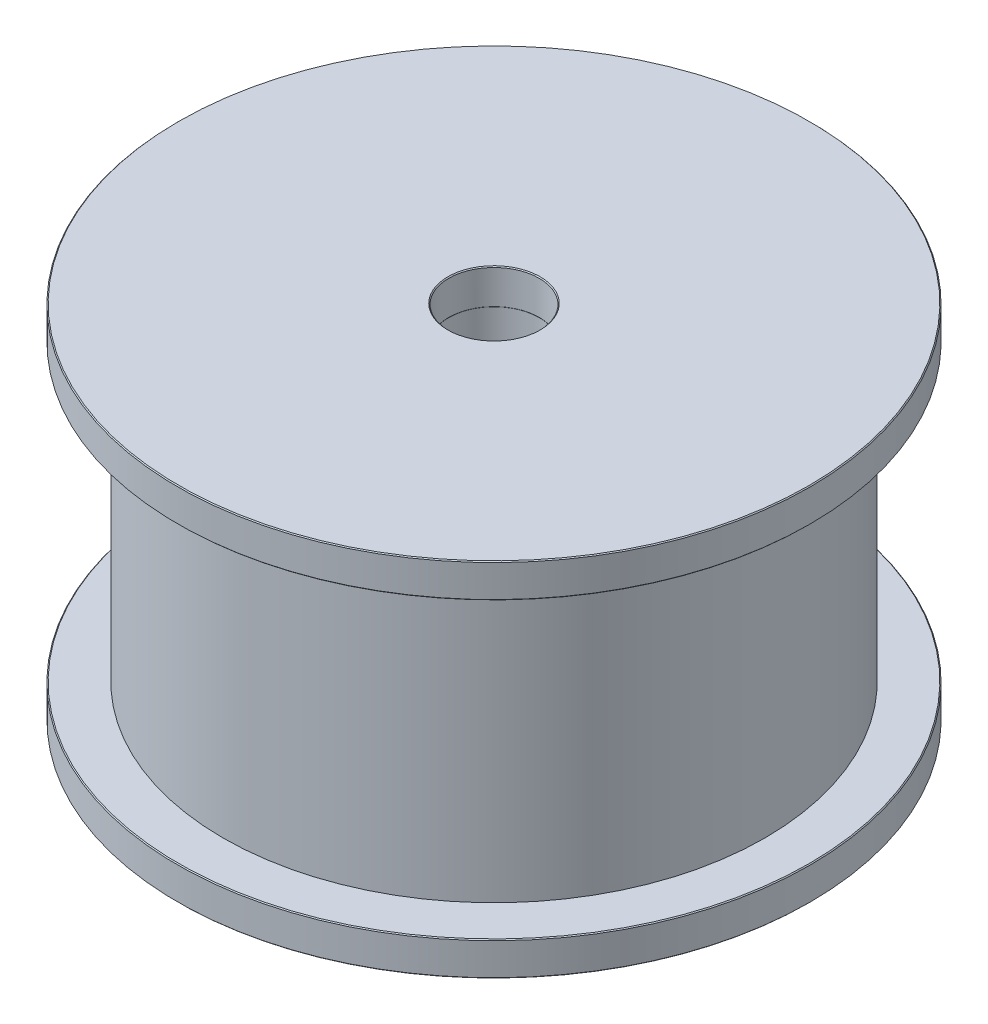
ISO-10303-21;
HEADER;
FILE_DESCRIPTION(('STEP AP214'),'2;1');
FILE_NAME('part.step','',(''),(''),'','','');
FILE_SCHEMA(('AUTOMOTIVE_DESIGN { 1 0 10303 214 1 1 1 1 }'));
ENDSEC;
DATA;
#1=APPLICATION_CONTEXT('core data for automotive mechanical design processes');
#2=APPLICATION_PROTOCOL_DEFINITION('international standard','automotive_design',2000,#1);
#3=PRODUCT_CONTEXT('',#1,'mechanical');
#4=PRODUCT('Part','Part','',(#3));
#5=PRODUCT_RELATED_PRODUCT_CATEGORY('part','',(#4));
#6=PRODUCT_DEFINITION_FORMATION('','',#4);
#7=PRODUCT_DEFINITION_CONTEXT('part definition',#1,'design');
#8=PRODUCT_DEFINITION('design','',#6,#7);
#9=PRODUCT_DEFINITION_SHAPE('','',#8);
#10=(LENGTH_UNIT() NAMED_UNIT(*) SI_UNIT(.MILLI.,.METRE.));
#11=(NAMED_UNIT(*) PLANE_ANGLE_UNIT() SI_UNIT($,.RADIAN.));
#12=(NAMED_UNIT(*) SI_UNIT($,.STERADIAN.) SOLID_ANGLE_UNIT());
#13=UNCERTAINTY_MEASURE_WITH_UNIT(LENGTH_MEASURE(1.E-05),#10,'distance_accuracy_value','');
#14=(GEOMETRIC_REPRESENTATION_CONTEXT(3) GLOBAL_UNCERTAINTY_ASSIGNED_CONTEXT((#13)) GLOBAL_UNIT_ASSIGNED_CONTEXT((#10,
#11,#12)) REPRESENTATION_CONTEXT('',''));
#15=CARTESIAN_POINT('',(0.,0.,0.));
#16=DIRECTION('',(0.,0.,1.));
#17=DIRECTION('',(1.,0.,0.));
#18=AXIS2_PLACEMENT_3D('',#15,#16,#17);
#19=CARTESIAN_POINT('',(0.,50.8,0.));
#20=DIRECTION('',(0.,1.,0.));
#21=DIRECTION('',(-1.,0.,0.));
#22=AXIS2_PLACEMENT_3D('',#19,#20,#21);
#23=CYLINDRICAL_SURFACE('',#22,44.45);
#24=CARTESIAN_POINT('',(0.,4.63550000000001,0.));
#25=DIRECTION('',(0.,-1.,0.));
#26=DIRECTION('',(1.,0.,0.));
#27=AXIS2_PLACEMENT_3D('',#24,#25,#26);
#28=CIRCLE('',#27,44.45);
#29=CARTESIAN_POINT('',(44.45,4.63550000000001,0.));
#30=VERTEX_POINT('',#29);
#31=EDGE_CURVE('E94',#30,#30,#28,.T.);
#32=ORIENTED_EDGE('',*,*,#31,.T.);
#33=EDGE_LOOP('',(#32));
#34=FACE_BOUND('',#33,.T.);
#35=CARTESIAN_POINT('',(0.,0.126999999999988,0.));
#36=DIRECTION('',(0.,1.,0.));
#37=DIRECTION('',(-1.,0.,0.));
#38=AXIS2_PLACEMENT_3D('',#35,#36,#37);
#39=CIRCLE('',#38,44.45);
#40=CARTESIAN_POINT('',(-44.45,0.12699999999999,0.));
#41=VERTEX_POINT('',#40);
#42=EDGE_CURVE('E98',#41,#41,#39,.T.);
#43=ORIENTED_EDGE('',*,*,#42,.T.);
#44=EDGE_LOOP('',(#43));
#45=FACE_BOUND('',#44,.T.);
#46=ADVANCED_FACE('F45',(#34,#45),#23,.T.);
#47=CARTESIAN_POINT('',(44.45,4.7625,0.));
#48=DIRECTION('',(0.,-1.,0.));
#49=DIRECTION('',(1.,0.,0.));
#50=AXIS2_PLACEMENT_3D('',#47,#48,#49);
#51=PLANE('',#50);
#52=CARTESIAN_POINT('',(0.,4.7625,0.));
#53=DIRECTION('',(0.,-1.,0.));
#54=DIRECTION('',(1.,0.,0.));
#55=AXIS2_PLACEMENT_3D('',#52,#53,#54);
#56=CIRCLE('',#55,44.323);
#57=CARTESIAN_POINT('',(44.323,4.7625,0.));
#58=VERTEX_POINT('',#57);
#59=EDGE_CURVE('E102',#58,#58,#56,.F.);
#60=ORIENTED_EDGE('',*,*,#59,.T.);
#61=EDGE_LOOP('',(#60));
#62=FACE_BOUND('',#61,.T.);
#63=CARTESIAN_POINT('',(0.,4.7625,0.));
#64=DIRECTION('',(0.,1.,0.));
#65=DIRECTION('',(-1.,0.,0.));
#66=AXIS2_PLACEMENT_3D('',#63,#64,#65);
#67=CIRCLE('',#66,38.1);
#68=CARTESIAN_POINT('',(-38.1,4.7625,0.));
#69=VERTEX_POINT('',#68);
#70=EDGE_CURVE('E118',#69,#69,#67,.T.);
#71=ORIENTED_EDGE('',*,*,#70,.F.);
#72=EDGE_LOOP('',(#71));
#73=FACE_BOUND('',#72,.T.);
#74=ADVANCED_FACE('F132',(#62,#73),#51,.F.);
#75=CARTESIAN_POINT('',(0.,50.8,0.));
#76=DIRECTION('',(0.,1.,0.));
#77=DIRECTION('',(-1.,0.,0.));
#78=AXIS2_PLACEMENT_3D('',#75,#76,#77);
#79=CYLINDRICAL_SURFACE('',#78,38.1);
#80=CARTESIAN_POINT('',(0.,46.0375,0.));
#81=DIRECTION('',(0.,1.,0.));
#82=DIRECTION('',(-1.,0.,0.));
#83=AXIS2_PLACEMENT_3D('',#80,#81,#82);
#84=CIRCLE('',#83,38.1);
#85=CARTESIAN_POINT('',(-38.1,46.0375,0.));
#86=VERTEX_POINT('',#85);
#87=EDGE_CURVE('E122',#86,#86,#84,.T.);
#88=ORIENTED_EDGE('',*,*,#87,.F.);
#89=EDGE_LOOP('',(#88));
#90=FACE_BOUND('',#89,.T.);
#91=ORIENTED_EDGE('',*,*,#70,.T.);
#92=EDGE_LOOP('',(#91));
#93=FACE_BOUND('',#92,.T.);
#94=ADVANCED_FACE('F129',(#90,#93),#79,.T.);
#95=CARTESIAN_POINT('',(38.1,46.0375,0.));
#96=DIRECTION('',(0.,1.,0.));
#97=DIRECTION('',(-1.,0.,0.));
#98=AXIS2_PLACEMENT_3D('',#95,#96,#97);
#99=PLANE('',#98);
#100=CARTESIAN_POINT('',(0.,46.0375,0.));
#101=DIRECTION('',(0.,1.,0.));
#102=DIRECTION('',(-1.,0.,0.));
#103=AXIS2_PLACEMENT_3D('',#100,#101,#102);
#104=CIRCLE('',#103,44.323);
#105=CARTESIAN_POINT('',(-44.323,46.0375,0.));
#106=VERTEX_POINT('',#105);
#107=EDGE_CURVE('E106',#106,#106,#104,.F.);
#108=ORIENTED_EDGE('',*,*,#107,.T.);
#109=EDGE_LOOP('',(#108));
#110=FACE_BOUND('',#109,.T.);
#111=ORIENTED_EDGE('',*,*,#87,.T.);
#112=EDGE_LOOP('',(#111));
#113=FACE_BOUND('',#112,.T.);
#114=ADVANCED_FACE('F127',(#110,#113),#99,.F.);
#115=CARTESIAN_POINT('',(0.,50.8,0.));
#116=DIRECTION('',(0.,1.,0.));
#117=DIRECTION('',(-1.,0.,0.));
#118=AXIS2_PLACEMENT_3D('',#115,#116,#117);
#119=CYLINDRICAL_SURFACE('',#118,44.45);
#120=CARTESIAN_POINT('',(0.,46.1645,0.));
#121=DIRECTION('',(0.,1.,0.));
#122=DIRECTION('',(-1.,0.,0.));
#123=AXIS2_PLACEMENT_3D('',#120,#121,#122);
#124=CIRCLE('',#123,44.45);
#125=CARTESIAN_POINT('',(-44.45,46.1645,0.));
#126=VERTEX_POINT('',#125);
#127=EDGE_CURVE('E110',#126,#126,#124,.T.);
#128=ORIENTED_EDGE('',*,*,#127,.T.);
#129=EDGE_LOOP('',(#128));
#130=FACE_BOUND('',#129,.T.);
#131=CARTESIAN_POINT('',(0.,50.673,0.));
#132=DIRECTION('',(0.,-1.,0.));
#133=DIRECTION('',(1.,0.,0.));
#134=AXIS2_PLACEMENT_3D('',#131,#132,#133);
#135=CIRCLE('',#134,44.45);
#136=CARTESIAN_POINT('',(44.45,50.673,0.));
#137=VERTEX_POINT('',#136);
#138=EDGE_CURVE('E114',#137,#137,#135,.T.);
#139=ORIENTED_EDGE('',*,*,#138,.T.);
#140=EDGE_LOOP('',(#139));
#141=FACE_BOUND('',#140,.T.);
#142=ADVANCED_FACE('F207',(#130,#141),#119,.T.);
#143=CARTESIAN_POINT('',(44.45,50.8,0.));
#144=DIRECTION('',(0.,-1.,0.));
#145=DIRECTION('',(1.,0.,0.));
#146=AXIS2_PLACEMENT_3D('',#143,#144,#145);
#147=PLANE('',#146);
#148=CARTESIAN_POINT('',(0.,50.8,0.));
#149=DIRECTION('',(0.,-1.,0.));
#150=DIRECTION('',(1.,0.,0.));
#151=AXIS2_PLACEMENT_3D('',#148,#149,#150);
#152=CIRCLE('',#151,44.323);
#153=CARTESIAN_POINT('',(44.323,50.8,0.));
#154=VERTEX_POINT('',#153);
#155=EDGE_CURVE('E64',#154,#154,#152,.F.);
#156=ORIENTED_EDGE('',*,*,#155,.T.);
#157=EDGE_LOOP('',(#156));
#158=FACE_BOUND('',#157,.T.);
#159=CARTESIAN_POINT('',(0.,50.8,0.));
#160=DIRECTION('',(0.,-1.,0.));
#161=DIRECTION('',(1.,0.,0.));
#162=AXIS2_PLACEMENT_3D('',#159,#160,#161);
#163=CIRCLE('',#162,6.48970000000004);
#164=CARTESIAN_POINT('',(6.48970000000005,50.8,0.));
#165=VERTEX_POINT('',#164);
#166=EDGE_CURVE('E70',#165,#165,#163,.T.);
#167=ORIENTED_EDGE('',*,*,#166,.T.);
#168=EDGE_LOOP('',(#167));
#169=FACE_BOUND('',#168,.T.);
#170=ADVANCED_FACE('F203',(#158,#169),#147,.F.);
#171=CARTESIAN_POINT('',(0.,50.8,0.));
#172=DIRECTION('',(0.,1.,0.));
#173=DIRECTION('',(-1.,0.,0.));
#174=AXIS2_PLACEMENT_3D('',#171,#172,#173);
#175=CYLINDRICAL_SURFACE('',#174,6.36270000000001);
#176=CARTESIAN_POINT('',(0.,45.9105,0.));
#177=DIRECTION('',(0.,1.,0.));
#178=DIRECTION('',(-1.,0.,0.));
#179=AXIS2_PLACEMENT_3D('',#176,#177,#178);
#180=CIRCLE('',#179,6.36270000000001);
#181=CARTESIAN_POINT('',(-6.3627,45.9105,0.));
#182=VERTEX_POINT('',#181);
#183=EDGE_CURVE('E54',#182,#182,#180,.F.);
#184=ORIENTED_EDGE('',*,*,#183,.T.);
#185=EDGE_LOOP('',(#184));
#186=FACE_BOUND('',#185,.T.);
#187=CARTESIAN_POINT('',(0.,50.673,0.));
#188=DIRECTION('',(0.,-1.,0.));
#189=DIRECTION('',(1.,0.,0.));
#190=AXIS2_PLACEMENT_3D('',#187,#188,#189);
#191=CIRCLE('',#190,6.36270000000001);
#192=CARTESIAN_POINT('',(6.36270000000001,50.673,0.));
#193=VERTEX_POINT('',#192);
#194=EDGE_CURVE('E59',#193,#193,#191,.F.);
#195=ORIENTED_EDGE('',*,*,#194,.T.);
#196=EDGE_LOOP('',(#195));
#197=FACE_BOUND('',#196,.T.);
#198=ADVANCED_FACE('F206',(#186,#197),#175,.F.);
#199=CARTESIAN_POINT('',(0.,50.8,0.));
#200=DIRECTION('',(0.,1.,0.));
#201=DIRECTION('',(-1.,0.,0.));
#202=AXIS2_PLACEMENT_3D('',#199,#200,#201);
#203=CYLINDRICAL_SURFACE('',#202,6.35);
#204=CARTESIAN_POINT('',(0.,45.8978,0.));
#205=DIRECTION('',(0.,-1.,0.));
#206=DIRECTION('',(1.,0.,0.));
#207=AXIS2_PLACEMENT_3D('',#204,#205,#206);
#208=CIRCLE('',#207,6.35);
#209=CARTESIAN_POINT('',(6.35000000000001,45.8978,0.));
#210=VERTEX_POINT('',#209);
#211=EDGE_CURVE('E74',#210,#210,#208,.F.);
#212=ORIENTED_EDGE('',*,*,#211,.T.);
#213=EDGE_LOOP('',(#212));
#214=FACE_BOUND('',#213,.T.);
#215=CARTESIAN_POINT('',(0.,4.9022,0.));
#216=DIRECTION('',(0.,1.,0.));
#217=DIRECTION('',(-1.,0.,0.));
#218=AXIS2_PLACEMENT_3D('',#215,#216,#217);
#219=CIRCLE('',#218,6.35);
#220=CARTESIAN_POINT('',(-6.35,4.9022,0.));
#221=VERTEX_POINT('',#220);
#222=EDGE_CURVE('E78',#221,#221,#219,.F.);
#223=ORIENTED_EDGE('',*,*,#222,.T.);
#224=EDGE_LOOP('',(#223));
#225=FACE_BOUND('',#224,.T.);
#226=ADVANCED_FACE('F214',(#214,#225),#203,.F.);
#227=CARTESIAN_POINT('',(0.,50.8,0.));
#228=DIRECTION('',(0.,1.,0.));
#229=DIRECTION('',(-1.,0.,0.));
#230=AXIS2_PLACEMENT_3D('',#227,#228,#229);
#231=CYLINDRICAL_SURFACE('',#230,6.3627);
#232=CARTESIAN_POINT('',(0.,4.8895,0.));
#233=DIRECTION('',(0.,-1.,0.));
#234=DIRECTION('',(1.,0.,0.));
#235=AXIS2_PLACEMENT_3D('',#232,#233,#234);
#236=CIRCLE('',#235,6.3627);
#237=CARTESIAN_POINT('',(6.3627,4.8895,0.));
#238=VERTEX_POINT('',#237);
#239=EDGE_CURVE('E10',#238,#238,#236,.F.);
#240=ORIENTED_EDGE('',*,*,#239,.T.);
#241=EDGE_LOOP('',(#240));
#242=FACE_BOUND('',#241,.T.);
#243=CARTESIAN_POINT('',(0.,0.127000000000002,0.));
#244=DIRECTION('',(0.,1.,0.));
#245=DIRECTION('',(-1.,0.,0.));
#246=AXIS2_PLACEMENT_3D('',#243,#244,#245);
#247=CIRCLE('',#246,6.3627);
#248=CARTESIAN_POINT('',(-6.3627,0.127000000000002,0.));
#249=VERTEX_POINT('',#248);
#250=EDGE_CURVE('E82',#249,#249,#247,.F.);
#251=ORIENTED_EDGE('',*,*,#250,.T.);
#252=EDGE_LOOP('',(#251));
#253=FACE_BOUND('',#252,.T.);
#254=ADVANCED_FACE('F219',(#242,#253),#231,.F.);
#255=CARTESIAN_POINT('',(6.3627,0.,0.));
#256=DIRECTION('',(0.,1.,0.));
#257=DIRECTION('',(-1.,0.,0.));
#258=AXIS2_PLACEMENT_3D('',#255,#256,#257);
#259=PLANE('',#258);
#260=CARTESIAN_POINT('',(0.,0.,0.));
#261=DIRECTION('',(0.,1.,0.));
#262=DIRECTION('',(-1.,0.,0.));
#263=AXIS2_PLACEMENT_3D('',#260,#261,#262);
#264=CIRCLE('',#263,6.4897);
#265=CARTESIAN_POINT('',(-6.4897,0.,0.));
#266=VERTEX_POINT('',#265);
#267=EDGE_CURVE('E86',#266,#266,#264,.T.);
#268=ORIENTED_EDGE('',*,*,#267,.T.);
#269=EDGE_LOOP('',(#268));
#270=FACE_BOUND('',#269,.T.);
#271=CARTESIAN_POINT('',(0.,0.,0.));
#272=DIRECTION('',(0.,1.,0.));
#273=DIRECTION('',(-1.,0.,0.));
#274=AXIS2_PLACEMENT_3D('',#271,#272,#273);
#275=CIRCLE('',#274,44.323);
#276=CARTESIAN_POINT('',(-44.323,0.,0.));
#277=VERTEX_POINT('',#276);
#278=EDGE_CURVE('E90',#277,#277,#275,.F.);
#279=ORIENTED_EDGE('',*,*,#278,.T.);
#280=EDGE_LOOP('',(#279));
#281=FACE_BOUND('',#280,.T.);
#282=ADVANCED_FACE('F155',(#270,#281),#259,.F.);
#283=CARTESIAN_POINT('',(0.,46.1645,0.));
#284=DIRECTION('',(0.,1.,0.));
#285=DIRECTION('',(-1.,0.,0.));
#286=AXIS2_PLACEMENT_3D('',#283,#284,#285);
#287=CONICAL_SURFACE('',#286,44.45,0.785398163397448);
#288=ORIENTED_EDGE('',*,*,#107,.F.);
#289=EDGE_LOOP('',(#288));
#290=FACE_BOUND('',#289,.T.);
#291=ORIENTED_EDGE('',*,*,#127,.F.);
#292=EDGE_LOOP('',(#291));
#293=FACE_BOUND('',#292,.T.);
#294=ADVANCED_FACE('F148',(#290,#293),#287,.T.);
#295=CARTESIAN_POINT('',(0.,4.7625,0.));
#296=DIRECTION('',(0.,-1.,0.));
#297=DIRECTION('',(1.,0.,0.));
#298=AXIS2_PLACEMENT_3D('',#295,#296,#297);
#299=CONICAL_SURFACE('',#298,44.323,0.785398163397394);
#300=ORIENTED_EDGE('',*,*,#31,.F.);
#301=EDGE_LOOP('',(#300));
#302=FACE_BOUND('',#301,.T.);
#303=ORIENTED_EDGE('',*,*,#59,.F.);
#304=EDGE_LOOP('',(#303));
#305=FACE_BOUND('',#304,.T.);
#306=ADVANCED_FACE('F154',(#302,#305),#299,.T.);
#307=CARTESIAN_POINT('',(0.,0.,0.));
#308=DIRECTION('',(0.,-1.,0.));
#309=DIRECTION('',(1.,0.,0.));
#310=AXIS2_PLACEMENT_3D('',#307,#308,#309);
#311=CONICAL_SURFACE('',#310,6.4897,0.785398163397438);
#312=ORIENTED_EDGE('',*,*,#250,.F.);
#313=EDGE_LOOP('',(#312));
#314=FACE_BOUND('',#313,.T.);
#315=ORIENTED_EDGE('',*,*,#267,.F.);
#316=EDGE_LOOP('',(#315));
#317=FACE_BOUND('',#316,.T.);
#318=ADVANCED_FACE('F162',(#314,#317),#311,.F.);
#319=CARTESIAN_POINT('',(0.,0.126999999999988,0.));
#320=DIRECTION('',(0.,1.,0.));
#321=DIRECTION('',(-1.,0.,0.));
#322=AXIS2_PLACEMENT_3D('',#319,#320,#321);
#323=CONICAL_SURFACE('',#322,44.45,0.785398163397448);
#324=ORIENTED_EDGE('',*,*,#278,.F.);
#325=EDGE_LOOP('',(#324));
#326=FACE_BOUND('',#325,.T.);
#327=ORIENTED_EDGE('',*,*,#42,.F.);
#328=EDGE_LOOP('',(#327));
#329=FACE_BOUND('',#328,.T.);
#330=ADVANCED_FACE('F169',(#326,#329),#323,.T.);
#331=CARTESIAN_POINT('',(0.,45.8978,0.));
#332=DIRECTION('',(0.,1.,0.));
#333=DIRECTION('',(-1.,0.,0.));
#334=AXIS2_PLACEMENT_3D('',#331,#332,#333);
#335=CONICAL_SURFACE('',#334,6.35,0.785398163397445);
#336=ORIENTED_EDGE('',*,*,#183,.F.);
#337=EDGE_LOOP('',(#336));
#338=FACE_BOUND('',#337,.T.);
#339=ORIENTED_EDGE('',*,*,#211,.F.);
#340=EDGE_LOOP('',(#339));
#341=FACE_BOUND('',#340,.T.);
#342=ADVANCED_FACE('F176',(#338,#341),#335,.F.);
#343=CARTESIAN_POINT('',(0.,4.7752,0.));
#344=DIRECTION('',(0.,-1.,0.));
#345=DIRECTION('',(1.,0.,0.));
#346=AXIS2_PLACEMENT_3D('',#343,#344,#345);
#347=CONICAL_SURFACE('',#346,6.47700000000001,0.785398163397448);
#348=ORIENTED_EDGE('',*,*,#222,.F.);
#349=EDGE_LOOP('',(#348));
#350=FACE_BOUND('',#349,.T.);
#351=ORIENTED_EDGE('',*,*,#239,.F.);
#352=EDGE_LOOP('',(#351));
#353=FACE_BOUND('',#352,.T.);
#354=ADVANCED_FACE('F183',(#350,#353),#347,.F.);
#355=CARTESIAN_POINT('',(0.,50.8,0.));
#356=DIRECTION('',(0.,-1.,0.));
#357=DIRECTION('',(1.,0.,0.));
#358=AXIS2_PLACEMENT_3D('',#355,#356,#357);
#359=CONICAL_SURFACE('',#358,44.323,0.785398163397394);
#360=ORIENTED_EDGE('',*,*,#138,.F.);
#361=EDGE_LOOP('',(#360));
#362=FACE_BOUND('',#361,.T.);
#363=ORIENTED_EDGE('',*,*,#155,.F.);
#364=EDGE_LOOP('',(#363));
#365=FACE_BOUND('',#364,.T.);
#366=ADVANCED_FACE('F189',(#362,#365),#359,.T.);
#367=CARTESIAN_POINT('',(0.,50.673,0.));
#368=DIRECTION('',(0.,1.,0.));
#369=DIRECTION('',(-1.,0.,0.));
#370=AXIS2_PLACEMENT_3D('',#367,#368,#369);
#371=CONICAL_SURFACE('',#370,6.36270000000001,0.785398163397421);
#372=ORIENTED_EDGE('',*,*,#166,.F.);
#373=EDGE_LOOP('',(#372));
#374=FACE_BOUND('',#373,.T.);
#375=ORIENTED_EDGE('',*,*,#194,.F.);
#376=EDGE_LOOP('',(#375));
#377=FACE_BOUND('',#376,.T.);
#378=ADVANCED_FACE('F48',(#374,#377),#371,.F.);
#379=CLOSED_SHELL('',(#46,#74,#94,#114,#142,#170,#198,#226,#254,#282,#294,#306,#318,#330,#342,
#354,#366,#378));
#380=MANIFOLD_SOLID_BREP('B2',#379);
#381=ADVANCED_BREP_SHAPE_REPRESENTATION('',(#18,#380),#14);
#382=SHAPE_DEFINITION_REPRESENTATION(#9,#381);
ENDSEC;
END-ISO-10303-21;
